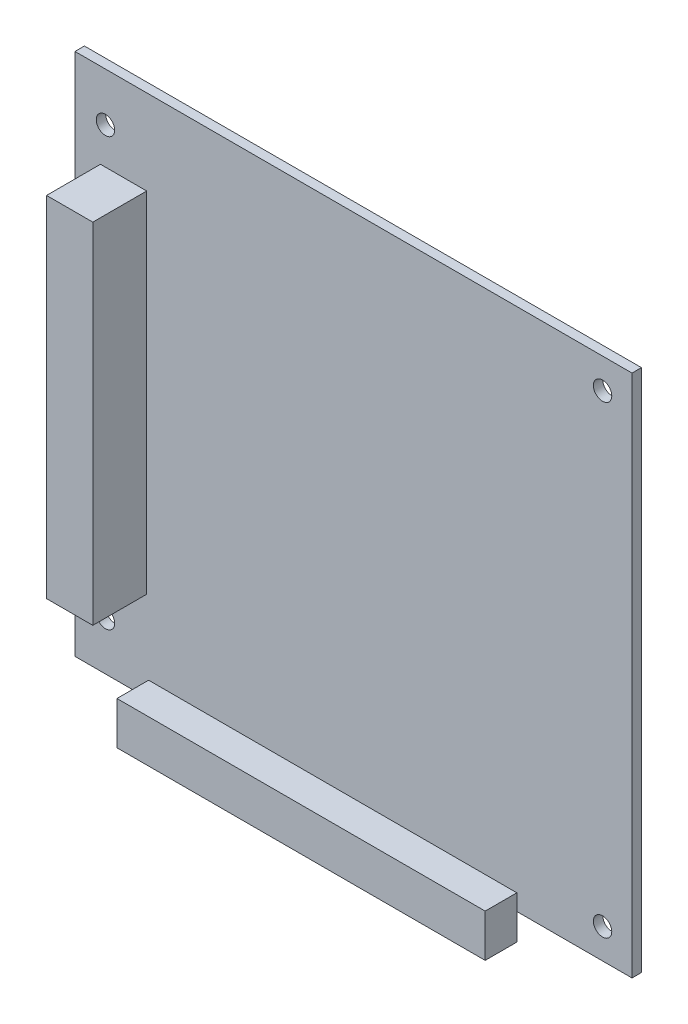
ISO-10303-21;
HEADER;
FILE_DESCRIPTION(('STEP AP214'),'2;1');
FILE_NAME('part.step','',(''),(''),'','','');
FILE_SCHEMA(('AUTOMOTIVE_DESIGN { 1 0 10303 214 1 1 1 1 }'));
ENDSEC;
DATA;
#1=APPLICATION_CONTEXT('core data for automotive mechanical design processes');
#2=APPLICATION_PROTOCOL_DEFINITION('international standard','automotive_design',2000,#1);
#3=PRODUCT_CONTEXT('',#1,'mechanical');
#4=PRODUCT('Part','Part','',(#3));
#5=PRODUCT_RELATED_PRODUCT_CATEGORY('part','',(#4));
#6=PRODUCT_DEFINITION_FORMATION('','',#4);
#7=PRODUCT_DEFINITION_CONTEXT('part definition',#1,'design');
#8=PRODUCT_DEFINITION('design','',#6,#7);
#9=PRODUCT_DEFINITION_SHAPE('','',#8);
#10=(LENGTH_UNIT() NAMED_UNIT(*) SI_UNIT(.MILLI.,.METRE.));
#11=(NAMED_UNIT(*) PLANE_ANGLE_UNIT() SI_UNIT($,.RADIAN.));
#12=(NAMED_UNIT(*) SI_UNIT($,.STERADIAN.) SOLID_ANGLE_UNIT());
#13=UNCERTAINTY_MEASURE_WITH_UNIT(LENGTH_MEASURE(1.E-05),#10,'distance_accuracy_value','');
#14=(GEOMETRIC_REPRESENTATION_CONTEXT(3) GLOBAL_UNCERTAINTY_ASSIGNED_CONTEXT((#13)) GLOBAL_UNIT_ASSIGNED_CONTEXT((#10,
#11,#12)) REPRESENTATION_CONTEXT('',''));
#15=CARTESIAN_POINT('',(0.,0.,0.));
#16=DIRECTION('',(0.,0.,1.));
#17=DIRECTION('',(1.,0.,0.));
#18=AXIS2_PLACEMENT_3D('',#15,#16,#17);
#19=CARTESIAN_POINT('',(48.0314,45.1739,1.6256));
#20=DIRECTION('',(0.,0.,-1.));
#21=DIRECTION('',(-1.,0.,0.));
#22=AXIS2_PLACEMENT_3D('',#19,#20,#21);
#23=PLANE('',#22);
#24=DIRECTION('',(0.,-1.,0.));
#25=VECTOR('',#24,1.);
#26=CARTESIAN_POINT('',(-43.6372,30.5181,1.6256));
#27=LINE('',#26,#25);
#28=CARTESIAN_POINT('',(-43.6372,30.5181,1.6256));
#29=VERTEX_POINT('',#28);
#30=CARTESIAN_POINT('',(-43.6372,-29.7053,1.6256));
#31=VERTEX_POINT('',#30);
#32=EDGE_CURVE('E159',#29,#31,#27,.T.);
#33=ORIENTED_EDGE('',*,*,#32,.F.);
#34=DIRECTION('',(-1.,0.,0.));
#35=VECTOR('',#34,1.);
#36=CARTESIAN_POINT('',(-43.6372,30.5181,1.6256));
#37=LINE('',#36,#35);
#38=CARTESIAN_POINT('',(-35.6616,30.5181,1.6256));
#39=VERTEX_POINT('',#38);
#40=EDGE_CURVE('E172',#39,#29,#37,.T.);
#41=ORIENTED_EDGE('',*,*,#40,.F.);
#42=DIRECTION('',(0.,1.,0.));
#43=VECTOR('',#42,1.);
#44=CARTESIAN_POINT('',(-35.6616,30.5181,1.6256));
#45=LINE('',#44,#43);
#46=CARTESIAN_POINT('',(-35.6616,-29.7053,1.6256));
#47=VERTEX_POINT('',#46);
#48=EDGE_CURVE('E181',#47,#39,#45,.T.);
#49=ORIENTED_EDGE('',*,*,#48,.F.);
#50=DIRECTION('',(1.,0.,0.));
#51=VECTOR('',#50,1.);
#52=CARTESIAN_POINT('',(-43.6372,-29.7053,1.6256));
#53=LINE('',#52,#51);
#54=EDGE_CURVE('E162',#31,#47,#53,.T.);
#55=ORIENTED_EDGE('',*,*,#54,.F.);
#56=EDGE_LOOP('',(#33,#41,#49,#55));
#57=FACE_BOUND('',#56,.T.);
#58=CARTESIAN_POINT('',(-42.7736,-36.83,1.6256));
#59=DIRECTION('',(0.,0.,1.));
#60=DIRECTION('',(1.,0.,0.));
#61=AXIS2_PLACEMENT_3D('',#58,#59,#60);
#62=CIRCLE('',#61,1.5875);
#63=CARTESIAN_POINT('',(-41.1861,-36.83,1.6256));
#64=VERTEX_POINT('',#63);
#65=EDGE_CURVE('E197',#64,#64,#62,.T.);
#66=ORIENTED_EDGE('',*,*,#65,.F.);
#67=EDGE_LOOP('',(#66));
#68=FACE_BOUND('',#67,.T.);
#69=CARTESIAN_POINT('',(42.9514,-40.005,1.6256));
#70=DIRECTION('',(0.,0.,1.));
#71=DIRECTION('',(1.,0.,0.));
#72=AXIS2_PLACEMENT_3D('',#69,#70,#71);
#73=CIRCLE('',#72,1.5875);
#74=CARTESIAN_POINT('',(44.5389,-40.005,1.6256));
#75=VERTEX_POINT('',#74);
#76=EDGE_CURVE('E201',#75,#75,#73,.T.);
#77=ORIENTED_EDGE('',*,*,#76,.F.);
#78=EDGE_LOOP('',(#77));
#79=FACE_BOUND('',#78,.T.);
#80=CARTESIAN_POINT('',(42.9514,40.005,1.6256));
#81=DIRECTION('',(0.,0.,1.));
#82=DIRECTION('',(1.,0.,0.));
#83=AXIS2_PLACEMENT_3D('',#80,#81,#82);
#84=CIRCLE('',#83,1.5875);
#85=CARTESIAN_POINT('',(44.5389,40.005,1.6256));
#86=VERTEX_POINT('',#85);
#87=EDGE_CURVE('E208',#86,#86,#84,.T.);
#88=ORIENTED_EDGE('',*,*,#87,.F.);
#89=EDGE_LOOP('',(#88));
#90=FACE_BOUND('',#89,.T.);
#91=CARTESIAN_POINT('',(-42.7736,36.83,1.6256));
#92=DIRECTION('',(0.,0.,1.));
#93=DIRECTION('',(1.,0.,0.));
#94=AXIS2_PLACEMENT_3D('',#91,#92,#93);
#95=CIRCLE('',#94,1.5875);
#96=CARTESIAN_POINT('',(-41.1861,36.83,1.6256));
#97=VERTEX_POINT('',#96);
#98=EDGE_CURVE('E215',#97,#97,#95,.T.);
#99=ORIENTED_EDGE('',*,*,#98,.F.);
#100=EDGE_LOOP('',(#99));
#101=FACE_BOUND('',#100,.T.);
#102=DIRECTION('',(0.,-1.,0.));
#103=VECTOR('',#102,1.);
#104=CARTESIAN_POINT('',(-35.3314,-42.3799,1.6256));
#105=LINE('',#104,#103);
#106=CARTESIAN_POINT('',(-35.3314,-42.3799,1.6256));
#107=VERTEX_POINT('',#106);
#108=CARTESIAN_POINT('',(-35.3314,-45.1739,1.6256));
#109=VERTEX_POINT('',#108);
#110=EDGE_CURVE('E53',#107,#109,#105,.T.);
#111=ORIENTED_EDGE('',*,*,#110,.F.);
#112=DIRECTION('',(-1.,0.,0.));
#113=VECTOR('',#112,1.);
#114=CARTESIAN_POINT('',(-35.3314,-42.3799,1.6256));
#115=LINE('',#114,#113);
#116=CARTESIAN_POINT('',(28.1686,-42.3799,1.6256));
#117=VERTEX_POINT('',#116);
#118=EDGE_CURVE('E57',#117,#107,#115,.T.);
#119=ORIENTED_EDGE('',*,*,#118,.F.);
#120=DIRECTION('',(0.,1.,0.));
#121=VECTOR('',#120,1.);
#122=CARTESIAN_POINT('',(28.1686,-42.3799,1.6256));
#123=LINE('',#122,#121);
#124=CARTESIAN_POINT('',(28.1686,-45.1739,1.6256));
#125=VERTEX_POINT('',#124);
#126=EDGE_CURVE('E273',#125,#117,#123,.T.);
#127=ORIENTED_EDGE('',*,*,#126,.F.);
#128=DIRECTION('',(1.,0.,0.));
#129=VECTOR('',#128,1.);
#130=CARTESIAN_POINT('',(-48.0314,-45.1739,1.6256));
#131=LINE('',#130,#129);
#132=CARTESIAN_POINT('',(48.0314,-45.1739,1.6256));
#133=VERTEX_POINT('',#132);
#134=EDGE_CURVE('E234',#125,#133,#131,.T.);
#135=ORIENTED_EDGE('',*,*,#134,.T.);
#136=DIRECTION('',(0.,1.,0.));
#137=VECTOR('',#136,1.);
#138=CARTESIAN_POINT('',(48.0314,-45.1739,1.6256));
#139=LINE('',#138,#137);
#140=CARTESIAN_POINT('',(48.0314,45.1739,1.6256));
#141=VERTEX_POINT('',#140);
#142=EDGE_CURVE('E224',#133,#141,#139,.T.);
#143=ORIENTED_EDGE('',*,*,#142,.T.);
#144=DIRECTION('',(-1.,0.,0.));
#145=VECTOR('',#144,1.);
#146=CARTESIAN_POINT('',(-48.0314,45.1739,1.6256));
#147=LINE('',#146,#145);
#148=CARTESIAN_POINT('',(-48.0314,45.1739,1.6256));
#149=VERTEX_POINT('',#148);
#150=EDGE_CURVE('E228',#141,#149,#147,.T.);
#151=ORIENTED_EDGE('',*,*,#150,.T.);
#152=DIRECTION('',(0.,-1.,0.));
#153=VECTOR('',#152,1.);
#154=CARTESIAN_POINT('',(-48.0314,-45.1739,1.6256));
#155=LINE('',#154,#153);
#156=CARTESIAN_POINT('',(-48.0314,-45.1739,1.6256));
#157=VERTEX_POINT('',#156);
#158=EDGE_CURVE('E232',#149,#157,#155,.T.);
#159=ORIENTED_EDGE('',*,*,#158,.T.);
#160=EDGE_CURVE('E235',#157,#109,#131,.T.);
#161=ORIENTED_EDGE('',*,*,#160,.T.);
#162=EDGE_LOOP('',(#111,#119,#127,#135,#143,#151,#159,#161));
#163=FACE_BOUND('',#162,.T.);
#164=ADVANCED_FACE('F38',(#57,#68,#79,#90,#101,#163),#23,.F.);
#165=CARTESIAN_POINT('',(48.0314,-45.1739,1.6256));
#166=DIRECTION('',(-1.,0.,0.));
#167=DIRECTION('',(0.,0.,1.));
#168=AXIS2_PLACEMENT_3D('',#165,#166,#167);
#169=PLANE('',#168);
#170=DIRECTION('',(0.,1.,0.));
#171=VECTOR('',#170,1.);
#172=CARTESIAN_POINT('',(48.0314,-45.1739,0.));
#173=LINE('',#172,#171);
#174=CARTESIAN_POINT('',(48.0314,-45.1739,0.));
#175=VERTEX_POINT('',#174);
#176=CARTESIAN_POINT('',(48.0314,45.1739,0.));
#177=VERTEX_POINT('',#176);
#178=EDGE_CURVE('E221',#175,#177,#173,.T.);
#179=ORIENTED_EDGE('',*,*,#178,.T.);
#180=DIRECTION('',(0.,0.,-1.));
#181=VECTOR('',#180,1.);
#182=CARTESIAN_POINT('',(48.0314,45.1739,1.6256));
#183=LINE('',#182,#181);
#184=EDGE_CURVE('E11',#141,#177,#183,.T.);
#185=ORIENTED_EDGE('',*,*,#184,.F.);
#186=ORIENTED_EDGE('',*,*,#142,.F.);
#187=DIRECTION('',(0.,0.,-1.));
#188=VECTOR('',#187,1.);
#189=CARTESIAN_POINT('',(48.0314,-45.1739,1.6256));
#190=LINE('',#189,#188);
#191=EDGE_CURVE('E237',#133,#175,#190,.T.);
#192=ORIENTED_EDGE('',*,*,#191,.T.);
#193=EDGE_LOOP('',(#179,#185,#186,#192));
#194=FACE_BOUND('',#193,.T.);
#195=ADVANCED_FACE('F40',(#194),#169,.F.);
#196=CARTESIAN_POINT('',(-48.0314,45.1739,1.6256));
#197=DIRECTION('',(0.,-1.,0.));
#198=DIRECTION('',(0.,0.,-1.));
#199=AXIS2_PLACEMENT_3D('',#196,#197,#198);
#200=PLANE('',#199);
#201=DIRECTION('',(-1.,0.,0.));
#202=VECTOR('',#201,1.);
#203=CARTESIAN_POINT('',(-48.0314,45.1739,0.));
#204=LINE('',#203,#202);
#205=CARTESIAN_POINT('',(-48.0314,45.1739,0.));
#206=VERTEX_POINT('',#205);
#207=EDGE_CURVE('E242',#177,#206,#204,.T.);
#208=ORIENTED_EDGE('',*,*,#207,.T.);
#209=DIRECTION('',(0.,0.,-1.));
#210=VECTOR('',#209,1.);
#211=CARTESIAN_POINT('',(-48.0314,45.1739,1.6256));
#212=LINE('',#211,#210);
#213=EDGE_CURVE('E46',#149,#206,#212,.T.);
#214=ORIENTED_EDGE('',*,*,#213,.F.);
#215=ORIENTED_EDGE('',*,*,#150,.F.);
#216=ORIENTED_EDGE('',*,*,#184,.T.);
#217=EDGE_LOOP('',(#208,#214,#215,#216));
#218=FACE_BOUND('',#217,.T.);
#219=ADVANCED_FACE('F311',(#218),#200,.F.);
#220=CARTESIAN_POINT('',(-48.0314,-45.1739,1.6256));
#221=DIRECTION('',(1.,0.,0.));
#222=DIRECTION('',(0.,0.,-1.));
#223=AXIS2_PLACEMENT_3D('',#220,#221,#222);
#224=PLANE('',#223);
#225=DIRECTION('',(0.,-1.,0.));
#226=VECTOR('',#225,1.);
#227=CARTESIAN_POINT('',(-48.0314,-45.1739,0.));
#228=LINE('',#227,#226);
#229=CARTESIAN_POINT('',(-48.0314,-45.1739,0.));
#230=VERTEX_POINT('',#229);
#231=EDGE_CURVE('E245',#206,#230,#228,.T.);
#232=ORIENTED_EDGE('',*,*,#231,.T.);
#233=DIRECTION('',(0.,0.,-1.));
#234=VECTOR('',#233,1.);
#235=CARTESIAN_POINT('',(-48.0314,-45.1739,1.6256));
#236=LINE('',#235,#234);
#237=EDGE_CURVE('E252',#157,#230,#236,.T.);
#238=ORIENTED_EDGE('',*,*,#237,.F.);
#239=ORIENTED_EDGE('',*,*,#158,.F.);
#240=ORIENTED_EDGE('',*,*,#213,.T.);
#241=EDGE_LOOP('',(#232,#238,#239,#240));
#242=FACE_BOUND('',#241,.T.);
#243=ADVANCED_FACE('F259',(#242),#224,.F.);
#244=CARTESIAN_POINT('',(-48.0314,-45.1739,1.6256));
#245=DIRECTION('',(0.,1.,0.));
#246=DIRECTION('',(0.,0.,1.));
#247=AXIS2_PLACEMENT_3D('',#244,#245,#246);
#248=PLANE('',#247);
#249=DIRECTION('',(1.,0.,0.));
#250=VECTOR('',#249,1.);
#251=CARTESIAN_POINT('',(-48.0314,-45.1739,0.));
#252=LINE('',#251,#250);
#253=EDGE_CURVE('E229',#230,#175,#252,.T.);
#254=ORIENTED_EDGE('',*,*,#253,.T.);
#255=ORIENTED_EDGE('',*,*,#191,.F.);
#256=ORIENTED_EDGE('',*,*,#134,.F.);
#257=EDGE_CURVE('E238',#109,#125,#131,.T.);
#258=ORIENTED_EDGE('',*,*,#257,.F.);
#259=ORIENTED_EDGE('',*,*,#160,.F.);
#260=ORIENTED_EDGE('',*,*,#237,.T.);
#261=EDGE_LOOP('',(#254,#255,#256,#258,#259,#260));
#262=FACE_BOUND('',#261,.T.);
#263=ADVANCED_FACE('F268',(#262),#248,.F.);
#264=CARTESIAN_POINT('',(48.0314,45.1739,0.));
#265=DIRECTION('',(0.,0.,-1.));
#266=DIRECTION('',(-1.,0.,0.));
#267=AXIS2_PLACEMENT_3D('',#264,#265,#266);
#268=PLANE('',#267);
#269=CARTESIAN_POINT('',(-42.7736,-36.83,0.));
#270=DIRECTION('',(0.,0.,1.));
#271=DIRECTION('',(1.,0.,0.));
#272=AXIS2_PLACEMENT_3D('',#269,#270,#271);
#273=CIRCLE('',#272,1.5875);
#274=CARTESIAN_POINT('',(-41.1861,-36.83,0.));
#275=VERTEX_POINT('',#274);
#276=EDGE_CURVE('E198',#275,#275,#273,.T.);
#277=ORIENTED_EDGE('',*,*,#276,.T.);
#278=EDGE_LOOP('',(#277));
#279=FACE_BOUND('',#278,.T.);
#280=CARTESIAN_POINT('',(42.9514,-40.005,0.));
#281=DIRECTION('',(0.,0.,1.));
#282=DIRECTION('',(1.,0.,0.));
#283=AXIS2_PLACEMENT_3D('',#280,#281,#282);
#284=CIRCLE('',#283,1.5875);
#285=CARTESIAN_POINT('',(44.5389,-40.005,0.));
#286=VERTEX_POINT('',#285);
#287=EDGE_CURVE('E204',#286,#286,#284,.T.);
#288=ORIENTED_EDGE('',*,*,#287,.T.);
#289=EDGE_LOOP('',(#288));
#290=FACE_BOUND('',#289,.T.);
#291=CARTESIAN_POINT('',(42.9514,40.005,0.));
#292=DIRECTION('',(0.,0.,1.));
#293=DIRECTION('',(1.,0.,0.));
#294=AXIS2_PLACEMENT_3D('',#291,#292,#293);
#295=CIRCLE('',#294,1.5875);
#296=CARTESIAN_POINT('',(44.5389,40.005,0.));
#297=VERTEX_POINT('',#296);
#298=EDGE_CURVE('E212',#297,#297,#295,.T.);
#299=ORIENTED_EDGE('',*,*,#298,.T.);
#300=EDGE_LOOP('',(#299));
#301=FACE_BOUND('',#300,.T.);
#302=CARTESIAN_POINT('',(-42.7736,36.83,0.));
#303=DIRECTION('',(0.,0.,1.));
#304=DIRECTION('',(1.,0.,0.));
#305=AXIS2_PLACEMENT_3D('',#302,#303,#304);
#306=CIRCLE('',#305,1.5875);
#307=CARTESIAN_POINT('',(-41.1861,36.83,0.));
#308=VERTEX_POINT('',#307);
#309=EDGE_CURVE('E218',#308,#308,#306,.T.);
#310=ORIENTED_EDGE('',*,*,#309,.T.);
#311=EDGE_LOOP('',(#310));
#312=FACE_BOUND('',#311,.T.);
#313=ORIENTED_EDGE('',*,*,#178,.F.);
#314=ORIENTED_EDGE('',*,*,#253,.F.);
#315=ORIENTED_EDGE('',*,*,#231,.F.);
#316=ORIENTED_EDGE('',*,*,#207,.F.);
#317=EDGE_LOOP('',(#313,#314,#315,#316));
#318=FACE_BOUND('',#317,.T.);
#319=ADVANCED_FACE('F265',(#279,#290,#301,#312,#318),#268,.T.);
#320=CARTESIAN_POINT('',(-42.7736,36.83,0.));
#321=DIRECTION('',(0.,0.,1.));
#322=DIRECTION('',(1.,0.,0.));
#323=AXIS2_PLACEMENT_3D('',#320,#321,#322);
#324=CYLINDRICAL_SURFACE('',#323,1.5875);
#325=ORIENTED_EDGE('',*,*,#309,.F.);
#326=EDGE_LOOP('',(#325));
#327=FACE_BOUND('',#326,.T.);
#328=ORIENTED_EDGE('',*,*,#98,.T.);
#329=EDGE_LOOP('',(#328));
#330=FACE_BOUND('',#329,.T.);
#331=ADVANCED_FACE('F315',(#327,#330),#324,.F.);
#332=CARTESIAN_POINT('',(42.9514,40.005,0.));
#333=DIRECTION('',(0.,0.,1.));
#334=DIRECTION('',(1.,0.,0.));
#335=AXIS2_PLACEMENT_3D('',#332,#333,#334);
#336=CYLINDRICAL_SURFACE('',#335,1.5875);
#337=ORIENTED_EDGE('',*,*,#298,.F.);
#338=EDGE_LOOP('',(#337));
#339=FACE_BOUND('',#338,.T.);
#340=ORIENTED_EDGE('',*,*,#87,.T.);
#341=EDGE_LOOP('',(#340));
#342=FACE_BOUND('',#341,.T.);
#343=ADVANCED_FACE('F347',(#339,#342),#336,.F.);
#344=CARTESIAN_POINT('',(42.9514,-40.005,0.));
#345=DIRECTION('',(0.,0.,1.));
#346=DIRECTION('',(1.,0.,0.));
#347=AXIS2_PLACEMENT_3D('',#344,#345,#346);
#348=CYLINDRICAL_SURFACE('',#347,1.5875);
#349=ORIENTED_EDGE('',*,*,#287,.F.);
#350=EDGE_LOOP('',(#349));
#351=FACE_BOUND('',#350,.T.);
#352=ORIENTED_EDGE('',*,*,#76,.T.);
#353=EDGE_LOOP('',(#352));
#354=FACE_BOUND('',#353,.T.);
#355=ADVANCED_FACE('F354',(#351,#354),#348,.F.);
#356=CARTESIAN_POINT('',(-42.7736,-36.83,0.));
#357=DIRECTION('',(0.,0.,1.));
#358=DIRECTION('',(1.,0.,0.));
#359=AXIS2_PLACEMENT_3D('',#356,#357,#358);
#360=CYLINDRICAL_SURFACE('',#359,1.5875);
#361=ORIENTED_EDGE('',*,*,#276,.F.);
#362=EDGE_LOOP('',(#361));
#363=FACE_BOUND('',#362,.T.);
#364=ORIENTED_EDGE('',*,*,#65,.T.);
#365=EDGE_LOOP('',(#364));
#366=FACE_BOUND('',#365,.T.);
#367=ADVANCED_FACE('F361',(#363,#366),#360,.F.);
#368=CARTESIAN_POINT('',(-43.6372,30.5181,10.922));
#369=DIRECTION('',(1.,0.,0.));
#370=DIRECTION('',(0.,1.,0.));
#371=AXIS2_PLACEMENT_3D('',#368,#369,#370);
#372=PLANE('',#371);
#373=ORIENTED_EDGE('',*,*,#32,.T.);
#374=DIRECTION('',(0.,0.,-1.));
#375=VECTOR('',#374,1.);
#376=CARTESIAN_POINT('',(-43.6372,-29.7053,10.922));
#377=LINE('',#376,#375);
#378=CARTESIAN_POINT('',(-43.6372,-29.7053,10.922));
#379=VERTEX_POINT('',#378);
#380=EDGE_CURVE('E194',#379,#31,#377,.T.);
#381=ORIENTED_EDGE('',*,*,#380,.F.);
#382=DIRECTION('',(0.,-1.,0.));
#383=VECTOR('',#382,1.);
#384=CARTESIAN_POINT('',(-43.6372,30.5181,10.922));
#385=LINE('',#384,#383);
#386=CARTESIAN_POINT('',(-43.6372,30.5181,10.922));
#387=VERTEX_POINT('',#386);
#388=EDGE_CURVE('E168',#387,#379,#385,.T.);
#389=ORIENTED_EDGE('',*,*,#388,.F.);
#390=DIRECTION('',(0.,0.,-1.));
#391=VECTOR('',#390,1.);
#392=CARTESIAN_POINT('',(-43.6372,30.5181,10.922));
#393=LINE('',#392,#391);
#394=EDGE_CURVE('E177',#387,#29,#393,.T.);
#395=ORIENTED_EDGE('',*,*,#394,.T.);
#396=EDGE_LOOP('',(#373,#381,#389,#395));
#397=FACE_BOUND('',#396,.T.);
#398=ADVANCED_FACE('F369',(#397),#372,.F.);
#399=CARTESIAN_POINT('',(-43.6372,-29.7053,10.922));
#400=DIRECTION('',(0.,1.,0.));
#401=DIRECTION('',(-1.,0.,0.));
#402=AXIS2_PLACEMENT_3D('',#399,#400,#401);
#403=PLANE('',#402);
#404=ORIENTED_EDGE('',*,*,#54,.T.);
#405=DIRECTION('',(0.,0.,-1.));
#406=VECTOR('',#405,1.);
#407=CARTESIAN_POINT('',(-35.6616,-29.7053,10.922));
#408=LINE('',#407,#406);
#409=CARTESIAN_POINT('',(-35.6616,-29.7053,10.922));
#410=VERTEX_POINT('',#409);
#411=EDGE_CURVE('E191',#410,#47,#408,.T.);
#412=ORIENTED_EDGE('',*,*,#411,.F.);
#413=DIRECTION('',(1.,0.,0.));
#414=VECTOR('',#413,1.);
#415=CARTESIAN_POINT('',(-43.6372,-29.7053,10.922));
#416=LINE('',#415,#414);
#417=EDGE_CURVE('E171',#379,#410,#416,.T.);
#418=ORIENTED_EDGE('',*,*,#417,.F.);
#419=ORIENTED_EDGE('',*,*,#380,.T.);
#420=EDGE_LOOP('',(#404,#412,#418,#419));
#421=FACE_BOUND('',#420,.T.);
#422=ADVANCED_FACE('F377',(#421),#403,.F.);
#423=CARTESIAN_POINT('',(-35.6616,30.5181,10.922));
#424=DIRECTION('',(-1.,0.,0.));
#425=DIRECTION('',(0.,-1.,0.));
#426=AXIS2_PLACEMENT_3D('',#423,#424,#425);
#427=PLANE('',#426);
#428=ORIENTED_EDGE('',*,*,#48,.T.);
#429=DIRECTION('',(0.,0.,-1.));
#430=VECTOR('',#429,1.);
#431=CARTESIAN_POINT('',(-35.6616,30.5181,10.922));
#432=LINE('',#431,#430);
#433=CARTESIAN_POINT('',(-35.6616,30.5181,10.922));
#434=VERTEX_POINT('',#433);
#435=EDGE_CURVE('E188',#434,#39,#432,.T.);
#436=ORIENTED_EDGE('',*,*,#435,.F.);
#437=DIRECTION('',(0.,1.,0.));
#438=VECTOR('',#437,1.);
#439=CARTESIAN_POINT('',(-35.6616,30.5181,10.922));
#440=LINE('',#439,#438);
#441=EDGE_CURVE('E174',#410,#434,#440,.T.);
#442=ORIENTED_EDGE('',*,*,#441,.F.);
#443=ORIENTED_EDGE('',*,*,#411,.T.);
#444=EDGE_LOOP('',(#428,#436,#442,#443));
#445=FACE_BOUND('',#444,.T.);
#446=ADVANCED_FACE('F385',(#445),#427,.F.);
#447=CARTESIAN_POINT('',(-43.6372,30.5181,10.922));
#448=DIRECTION('',(0.,-1.,0.));
#449=DIRECTION('',(0.,0.,-1.));
#450=AXIS2_PLACEMENT_3D('',#447,#448,#449);
#451=PLANE('',#450);
#452=ORIENTED_EDGE('',*,*,#40,.T.);
#453=ORIENTED_EDGE('',*,*,#394,.F.);
#454=DIRECTION('',(-1.,0.,0.));
#455=VECTOR('',#454,1.);
#456=CARTESIAN_POINT('',(-43.6372,30.5181,10.922));
#457=LINE('',#456,#455);
#458=EDGE_CURVE('E176',#434,#387,#457,.T.);
#459=ORIENTED_EDGE('',*,*,#458,.F.);
#460=ORIENTED_EDGE('',*,*,#435,.T.);
#461=EDGE_LOOP('',(#452,#453,#459,#460));
#462=FACE_BOUND('',#461,.T.);
#463=ADVANCED_FACE('F393',(#462),#451,.F.);
#464=CARTESIAN_POINT('',(-43.6372,-29.7053,10.922));
#465=DIRECTION('',(0.,0.,1.));
#466=DIRECTION('',(1.,0.,0.));
#467=AXIS2_PLACEMENT_3D('',#464,#465,#466);
#468=PLANE('',#467);
#469=ORIENTED_EDGE('',*,*,#388,.T.);
#470=ORIENTED_EDGE('',*,*,#417,.T.);
#471=ORIENTED_EDGE('',*,*,#441,.T.);
#472=ORIENTED_EDGE('',*,*,#458,.T.);
#473=EDGE_LOOP('',(#469,#470,#471,#472));
#474=FACE_BOUND('',#473,.T.);
#475=ADVANCED_FACE('F401',(#474),#468,.T.);
#476=CARTESIAN_POINT('',(-35.3314,-49.7459,1.6256));
#477=DIRECTION('',(0.,0.,1.));
#478=DIRECTION('',(1.,0.,0.));
#479=AXIS2_PLACEMENT_3D('',#476,#477,#478);
#480=PLANE('',#479);
#481=CARTESIAN_POINT('',(-35.3314,-49.7459,1.6256));
#482=VERTEX_POINT('',#481);
#483=EDGE_CURVE('E157',#109,#482,#105,.T.);
#484=ORIENTED_EDGE('',*,*,#483,.F.);
#485=ORIENTED_EDGE('',*,*,#257,.T.);
#486=CARTESIAN_POINT('',(28.1686,-49.7459,1.6256));
#487=VERTEX_POINT('',#486);
#488=EDGE_CURVE('E280',#487,#125,#123,.T.);
#489=ORIENTED_EDGE('',*,*,#488,.F.);
#490=DIRECTION('',(1.,0.,0.));
#491=VECTOR('',#490,1.);
#492=CARTESIAN_POINT('',(-35.3314,-49.7459,1.6256));
#493=LINE('',#492,#491);
#494=EDGE_CURVE('E287',#482,#487,#493,.T.);
#495=ORIENTED_EDGE('',*,*,#494,.F.);
#496=EDGE_LOOP('',(#484,#485,#489,#495));
#497=FACE_BOUND('',#496,.T.);
#498=ADVANCED_FACE('F279',(#497),#480,.F.);
#499=CARTESIAN_POINT('',(-35.3314,-42.3799,7.0866));
#500=DIRECTION('',(1.,0.,0.));
#501=DIRECTION('',(0.,0.,-1.));
#502=AXIS2_PLACEMENT_3D('',#499,#500,#501);
#503=PLANE('',#502);
#504=ORIENTED_EDGE('',*,*,#110,.T.);
#505=ORIENTED_EDGE('',*,*,#483,.T.);
#506=DIRECTION('',(0.,0.,-1.));
#507=VECTOR('',#506,1.);
#508=CARTESIAN_POINT('',(-35.3314,-49.7459,7.0866));
#509=LINE('',#508,#507);
#510=CARTESIAN_POINT('',(-35.3314,-49.7459,7.0866));
#511=VERTEX_POINT('',#510);
#512=EDGE_CURVE('E139',#511,#482,#509,.T.);
#513=ORIENTED_EDGE('',*,*,#512,.F.);
#514=DIRECTION('',(0.,-1.,0.));
#515=VECTOR('',#514,1.);
#516=CARTESIAN_POINT('',(-35.3314,-42.3799,7.0866));
#517=LINE('',#516,#515);
#518=CARTESIAN_POINT('',(-35.3314,-42.3799,7.0866));
#519=VERTEX_POINT('',#518);
#520=EDGE_CURVE('E145',#519,#511,#517,.T.);
#521=ORIENTED_EDGE('',*,*,#520,.F.);
#522=DIRECTION('',(0.,0.,-1.));
#523=VECTOR('',#522,1.);
#524=CARTESIAN_POINT('',(-35.3314,-42.3799,7.0866));
#525=LINE('',#524,#523);
#526=EDGE_CURVE('E291',#519,#107,#525,.T.);
#527=ORIENTED_EDGE('',*,*,#526,.T.);
#528=EDGE_LOOP('',(#504,#505,#513,#521,#527));
#529=FACE_BOUND('',#528,.T.);
#530=ADVANCED_FACE('F155',(#529),#503,.F.);
#531=CARTESIAN_POINT('',(-35.3314,-49.7459,7.0866));
#532=DIRECTION('',(0.,1.,0.));
#533=DIRECTION('',(0.,0.,1.));
#534=AXIS2_PLACEMENT_3D('',#531,#532,#533);
#535=PLANE('',#534);
#536=ORIENTED_EDGE('',*,*,#494,.T.);
#537=DIRECTION('',(0.,0.,-1.));
#538=VECTOR('',#537,1.);
#539=CARTESIAN_POINT('',(28.1686,-49.7459,7.0866));
#540=LINE('',#539,#538);
#541=CARTESIAN_POINT('',(28.1686,-49.7459,7.0866));
#542=VERTEX_POINT('',#541);
#543=EDGE_CURVE('E141',#542,#487,#540,.T.);
#544=ORIENTED_EDGE('',*,*,#543,.F.);
#545=DIRECTION('',(1.,0.,0.));
#546=VECTOR('',#545,1.);
#547=CARTESIAN_POINT('',(-35.3314,-49.7459,7.0866));
#548=LINE('',#547,#546);
#549=EDGE_CURVE('E135',#511,#542,#548,.T.);
#550=ORIENTED_EDGE('',*,*,#549,.F.);
#551=ORIENTED_EDGE('',*,*,#512,.T.);
#552=EDGE_LOOP('',(#536,#544,#550,#551));
#553=FACE_BOUND('',#552,.T.);
#554=ADVANCED_FACE('F137',(#553),#535,.F.);
#555=CARTESIAN_POINT('',(28.1686,-42.3799,7.0866));
#556=DIRECTION('',(-1.,0.,0.));
#557=DIRECTION('',(0.,0.,1.));
#558=AXIS2_PLACEMENT_3D('',#555,#556,#557);
#559=PLANE('',#558);
#560=ORIENTED_EDGE('',*,*,#488,.T.);
#561=ORIENTED_EDGE('',*,*,#126,.T.);
#562=DIRECTION('',(0.,0.,-1.));
#563=VECTOR('',#562,1.);
#564=CARTESIAN_POINT('',(28.1686,-42.3799,7.0866));
#565=LINE('',#564,#563);
#566=CARTESIAN_POINT('',(28.1686,-42.3799,7.0866));
#567=VERTEX_POINT('',#566);
#568=EDGE_CURVE('E164',#567,#117,#565,.T.);
#569=ORIENTED_EDGE('',*,*,#568,.F.);
#570=DIRECTION('',(0.,1.,0.));
#571=VECTOR('',#570,1.);
#572=CARTESIAN_POINT('',(28.1686,-42.3799,7.0866));
#573=LINE('',#572,#571);
#574=EDGE_CURVE('E144',#542,#567,#573,.T.);
#575=ORIENTED_EDGE('',*,*,#574,.F.);
#576=ORIENTED_EDGE('',*,*,#543,.T.);
#577=EDGE_LOOP('',(#560,#561,#569,#575,#576));
#578=FACE_BOUND('',#577,.T.);
#579=ADVANCED_FACE('F282',(#578),#559,.F.);
#580=CARTESIAN_POINT('',(-35.3314,-42.3799,7.0866));
#581=DIRECTION('',(0.,-1.,0.));
#582=DIRECTION('',(0.,0.,-1.));
#583=AXIS2_PLACEMENT_3D('',#580,#581,#582);
#584=PLANE('',#583);
#585=ORIENTED_EDGE('',*,*,#118,.T.);
#586=ORIENTED_EDGE('',*,*,#526,.F.);
#587=DIRECTION('',(-1.,0.,0.));
#588=VECTOR('',#587,1.);
#589=CARTESIAN_POINT('',(-35.3314,-42.3799,7.0866));
#590=LINE('',#589,#588);
#591=EDGE_CURVE('E150',#567,#519,#590,.T.);
#592=ORIENTED_EDGE('',*,*,#591,.F.);
#593=ORIENTED_EDGE('',*,*,#568,.T.);
#594=EDGE_LOOP('',(#585,#586,#592,#593));
#595=FACE_BOUND('',#594,.T.);
#596=ADVANCED_FACE('F293',(#595),#584,.F.);
#597=CARTESIAN_POINT('',(-35.3314,-49.7459,7.0866));
#598=DIRECTION('',(0.,0.,1.));
#599=DIRECTION('',(1.,0.,0.));
#600=AXIS2_PLACEMENT_3D('',#597,#598,#599);
#601=PLANE('',#600);
#602=ORIENTED_EDGE('',*,*,#520,.T.);
#603=ORIENTED_EDGE('',*,*,#549,.T.);
#604=ORIENTED_EDGE('',*,*,#574,.T.);
#605=ORIENTED_EDGE('',*,*,#591,.T.);
#606=EDGE_LOOP('',(#602,#603,#604,#605));
#607=FACE_BOUND('',#606,.T.);
#608=ADVANCED_FACE('F148',(#607),#601,.T.);
#609=CLOSED_SHELL('',(#164,#195,#219,#243,#263,#319,#331,#343,#355,#367,#398,#422,#446,#463,
#475,#498,#530,#554,#579,#596,#608));
#610=MANIFOLD_SOLID_BREP('B2',#609);
#611=ADVANCED_BREP_SHAPE_REPRESENTATION('',(#18,#610),#14);
#612=SHAPE_DEFINITION_REPRESENTATION(#9,#611);
ENDSEC;
END-ISO-10303-21;
